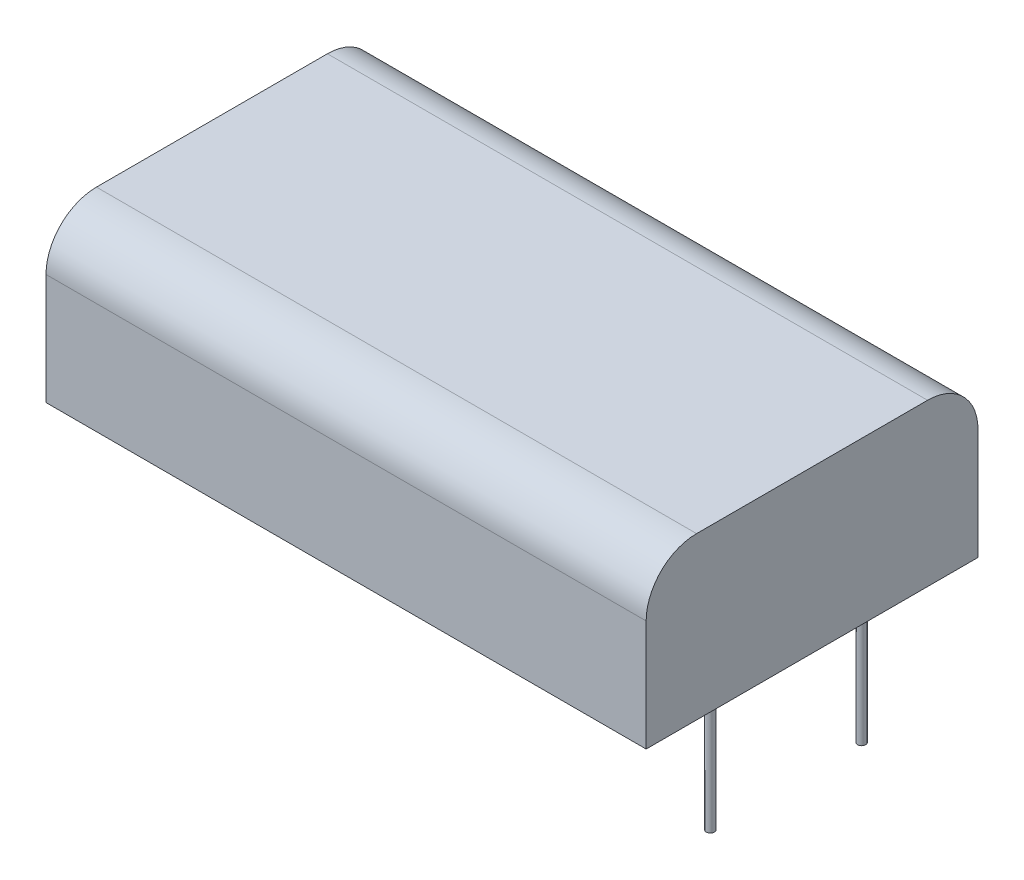
ISO-10303-21;
HEADER;
FILE_DESCRIPTION(('STEP AP214'),'2;1');
FILE_NAME('part.step','',(''),(''),'','','');
FILE_SCHEMA(('AUTOMOTIVE_DESIGN { 1 0 10303 214 1 1 1 1 }'));
ENDSEC;
DATA;
#1=APPLICATION_CONTEXT('core data for automotive mechanical design processes');
#2=APPLICATION_PROTOCOL_DEFINITION('international standard','automotive_design',2000,#1);
#3=PRODUCT_CONTEXT('',#1,'mechanical');
#4=PRODUCT('Part','Part','',(#3));
#5=PRODUCT_RELATED_PRODUCT_CATEGORY('part','',(#4));
#6=PRODUCT_DEFINITION_FORMATION('','',#4);
#7=PRODUCT_DEFINITION_CONTEXT('part definition',#1,'design');
#8=PRODUCT_DEFINITION('design','',#6,#7);
#9=PRODUCT_DEFINITION_SHAPE('','',#8);
#10=(LENGTH_UNIT() NAMED_UNIT(*) SI_UNIT(.MILLI.,.METRE.));
#11=(NAMED_UNIT(*) PLANE_ANGLE_UNIT() SI_UNIT($,.RADIAN.));
#12=(NAMED_UNIT(*) SI_UNIT($,.STERADIAN.) SOLID_ANGLE_UNIT());
#13=UNCERTAINTY_MEASURE_WITH_UNIT(LENGTH_MEASURE(1.E-05),#10,'distance_accuracy_value','');
#14=(GEOMETRIC_REPRESENTATION_CONTEXT(3) GLOBAL_UNCERTAINTY_ASSIGNED_CONTEXT((#13)) GLOBAL_UNIT_ASSIGNED_CONTEXT((#10,
#11,#12)) REPRESENTATION_CONTEXT('',''));
#15=CARTESIAN_POINT('',(0.,0.,0.));
#16=DIRECTION('',(0.,0.,1.));
#17=DIRECTION('',(1.,0.,0.));
#18=AXIS2_PLACEMENT_3D('',#15,#16,#17);
#19=CARTESIAN_POINT('',(29.75,16.,16.45));
#20=DIRECTION('',(-1.,0.,0.));
#21=DIRECTION('',(0.,0.,1.));
#22=AXIS2_PLACEMENT_3D('',#19,#20,#21);
#23=PLANE('',#22);
#24=DIRECTION('',(0.,-1.,0.));
#25=VECTOR('',#24,1.);
#26=CARTESIAN_POINT('',(29.75,16.,-16.45));
#27=LINE('',#26,#25);
#28=CARTESIAN_POINT('',(29.75,11.,-16.45));
#29=VERTEX_POINT('',#28);
#30=CARTESIAN_POINT('',(29.75,0.,-16.45));
#31=VERTEX_POINT('',#30);
#32=EDGE_CURVE('E84',#29,#31,#27,.T.);
#33=ORIENTED_EDGE('',*,*,#32,.F.);
#34=CARTESIAN_POINT('',(29.75,11.,-11.45));
#35=DIRECTION('',(-1.,0.,0.));
#36=DIRECTION('',(0.,0.,1.));
#37=AXIS2_PLACEMENT_3D('',#34,#35,#36);
#38=CIRCLE('',#37,5.);
#39=CARTESIAN_POINT('',(29.75,16.,-11.45));
#40=VERTEX_POINT('',#39);
#41=EDGE_CURVE('E41',#29,#40,#38,.F.);
#42=ORIENTED_EDGE('',*,*,#41,.T.);
#43=DIRECTION('',(0.,0.,-1.));
#44=VECTOR('',#43,1.);
#45=CARTESIAN_POINT('',(29.75,16.,16.45));
#46=LINE('',#45,#44);
#47=CARTESIAN_POINT('',(29.75,16.,11.45));
#48=VERTEX_POINT('',#47);
#49=EDGE_CURVE('E116',#48,#40,#46,.T.);
#50=ORIENTED_EDGE('',*,*,#49,.F.);
#51=CARTESIAN_POINT('',(29.75,11.,11.45));
#52=DIRECTION('',(-1.,0.,0.));
#53=DIRECTION('',(0.,0.,1.));
#54=AXIS2_PLACEMENT_3D('',#51,#52,#53);
#55=CIRCLE('',#54,5.);
#56=CARTESIAN_POINT('',(29.75,11.,16.45));
#57=VERTEX_POINT('',#56);
#58=EDGE_CURVE('E48',#48,#57,#55,.F.);
#59=ORIENTED_EDGE('',*,*,#58,.T.);
#60=DIRECTION('',(0.,-1.,0.));
#61=VECTOR('',#60,1.);
#62=CARTESIAN_POINT('',(29.75,16.,16.45));
#63=LINE('',#62,#61);
#64=CARTESIAN_POINT('',(29.75,0.,16.45));
#65=VERTEX_POINT('',#64);
#66=EDGE_CURVE('E102',#57,#65,#63,.T.);
#67=ORIENTED_EDGE('',*,*,#66,.T.);
#68=DIRECTION('',(0.,0.,-1.));
#69=VECTOR('',#68,1.);
#70=CARTESIAN_POINT('',(29.75,0.,16.45));
#71=LINE('',#70,#69);
#72=EDGE_CURVE('E98',#65,#31,#71,.T.);
#73=ORIENTED_EDGE('',*,*,#72,.T.);
#74=EDGE_LOOP('',(#33,#42,#50,#59,#67,#73));
#75=FACE_BOUND('',#74,.T.);
#76=ADVANCED_FACE('F33',(#75),#23,.F.);
#77=CARTESIAN_POINT('',(-29.75,16.,-16.45));
#78=DIRECTION('',(0.,0.,1.));
#79=DIRECTION('',(1.,0.,0.));
#80=AXIS2_PLACEMENT_3D('',#77,#78,#79);
#81=PLANE('',#80);
#82=DIRECTION('',(0.,-1.,0.));
#83=VECTOR('',#82,1.);
#84=CARTESIAN_POINT('',(-29.75,16.,-16.45));
#85=LINE('',#84,#83);
#86=CARTESIAN_POINT('',(-29.75,11.,-16.45));
#87=VERTEX_POINT('',#86);
#88=CARTESIAN_POINT('',(-29.75,0.,-16.45));
#89=VERTEX_POINT('',#88);
#90=EDGE_CURVE('E92',#87,#89,#85,.T.);
#91=ORIENTED_EDGE('',*,*,#90,.F.);
#92=DIRECTION('',(-1.,0.,0.));
#93=VECTOR('',#92,1.);
#94=CARTESIAN_POINT('',(-29.75,11.,-16.45));
#95=LINE('',#94,#93);
#96=EDGE_CURVE('E56',#87,#29,#95,.F.);
#97=ORIENTED_EDGE('',*,*,#96,.T.);
#98=ORIENTED_EDGE('',*,*,#32,.T.);
#99=DIRECTION('',(-1.,0.,0.));
#100=VECTOR('',#99,1.);
#101=CARTESIAN_POINT('',(-29.75,0.,-16.45));
#102=LINE('',#101,#100);
#103=EDGE_CURVE('E87',#31,#89,#102,.T.);
#104=ORIENTED_EDGE('',*,*,#103,.T.);
#105=EDGE_LOOP('',(#91,#97,#98,#104));
#106=FACE_BOUND('',#105,.T.);
#107=ADVANCED_FACE('F86',(#106),#81,.F.);
#108=CARTESIAN_POINT('',(-29.75,16.,16.45));
#109=DIRECTION('',(1.,0.,0.));
#110=DIRECTION('',(0.,0.,-1.));
#111=AXIS2_PLACEMENT_3D('',#108,#109,#110);
#112=PLANE('',#111);
#113=DIRECTION('',(0.,0.,1.));
#114=VECTOR('',#113,1.);
#115=CARTESIAN_POINT('',(-29.75,16.,16.45));
#116=LINE('',#115,#114);
#117=CARTESIAN_POINT('',(-29.75,16.,-11.45));
#118=VERTEX_POINT('',#117);
#119=CARTESIAN_POINT('',(-29.75,16.,11.45));
#120=VERTEX_POINT('',#119);
#121=EDGE_CURVE('E110',#118,#120,#116,.T.);
#122=ORIENTED_EDGE('',*,*,#121,.F.);
#123=CARTESIAN_POINT('',(-29.75,11.,-11.45));
#124=DIRECTION('',(1.,0.,0.));
#125=DIRECTION('',(0.,0.,-1.));
#126=AXIS2_PLACEMENT_3D('',#123,#124,#125);
#127=CIRCLE('',#126,5.);
#128=EDGE_CURVE('E128',#118,#87,#127,.F.);
#129=ORIENTED_EDGE('',*,*,#128,.T.);
#130=ORIENTED_EDGE('',*,*,#90,.T.);
#131=DIRECTION('',(0.,0.,1.));
#132=VECTOR('',#131,1.);
#133=CARTESIAN_POINT('',(-29.75,0.,16.45));
#134=LINE('',#133,#132);
#135=CARTESIAN_POINT('',(-29.75,0.,16.45));
#136=VERTEX_POINT('',#135);
#137=EDGE_CURVE('E100',#89,#136,#134,.T.);
#138=ORIENTED_EDGE('',*,*,#137,.T.);
#139=DIRECTION('',(0.,-1.,0.));
#140=VECTOR('',#139,1.);
#141=CARTESIAN_POINT('',(-29.75,16.,16.45));
#142=LINE('',#141,#140);
#143=CARTESIAN_POINT('',(-29.75,11.,16.45));
#144=VERTEX_POINT('',#143);
#145=EDGE_CURVE('E118',#144,#136,#142,.T.);
#146=ORIENTED_EDGE('',*,*,#145,.F.);
#147=CARTESIAN_POINT('',(-29.75,11.,11.45));
#148=DIRECTION('',(1.,0.,0.));
#149=DIRECTION('',(0.,0.,-1.));
#150=AXIS2_PLACEMENT_3D('',#147,#148,#149);
#151=CIRCLE('',#150,5.);
#152=EDGE_CURVE('E126',#144,#120,#151,.F.);
#153=ORIENTED_EDGE('',*,*,#152,.T.);
#154=EDGE_LOOP('',(#122,#129,#130,#138,#146,#153));
#155=FACE_BOUND('',#154,.T.);
#156=ADVANCED_FACE('F141',(#155),#112,.F.);
#157=CARTESIAN_POINT('',(-29.75,16.,16.45));
#158=DIRECTION('',(0.,0.,-1.));
#159=DIRECTION('',(-1.,0.,0.));
#160=AXIS2_PLACEMENT_3D('',#157,#158,#159);
#161=PLANE('',#160);
#162=ORIENTED_EDGE('',*,*,#66,.F.);
#163=DIRECTION('',(1.,0.,0.));
#164=VECTOR('',#163,1.);
#165=CARTESIAN_POINT('',(-29.75,11.,16.45));
#166=LINE('',#165,#164);
#167=EDGE_CURVE('E11',#57,#144,#166,.F.);
#168=ORIENTED_EDGE('',*,*,#167,.T.);
#169=ORIENTED_EDGE('',*,*,#145,.T.);
#170=DIRECTION('',(1.,0.,0.));
#171=VECTOR('',#170,1.);
#172=CARTESIAN_POINT('',(-29.75,0.,16.45));
#173=LINE('',#172,#171);
#174=EDGE_CURVE('E114',#136,#65,#173,.T.);
#175=ORIENTED_EDGE('',*,*,#174,.T.);
#176=EDGE_LOOP('',(#162,#168,#169,#175));
#177=FACE_BOUND('',#176,.T.);
#178=ADVANCED_FACE('F147',(#177),#161,.F.);
#179=CARTESIAN_POINT('',(0.,16.,0.));
#180=DIRECTION('',(0.,-1.,0.));
#181=DIRECTION('',(0.,0.,-1.));
#182=AXIS2_PLACEMENT_3D('',#179,#180,#181);
#183=PLANE('',#182);
#184=ORIENTED_EDGE('',*,*,#49,.T.);
#185=DIRECTION('',(-1.,0.,0.));
#186=VECTOR('',#185,1.);
#187=CARTESIAN_POINT('',(0.,16.,-11.45));
#188=LINE('',#187,#186);
#189=EDGE_CURVE('E123',#40,#118,#188,.T.);
#190=ORIENTED_EDGE('',*,*,#189,.T.);
#191=ORIENTED_EDGE('',*,*,#121,.T.);
#192=DIRECTION('',(1.,0.,0.));
#193=VECTOR('',#192,1.);
#194=CARTESIAN_POINT('',(0.,16.,11.45));
#195=LINE('',#194,#193);
#196=EDGE_CURVE('E91',#120,#48,#195,.T.);
#197=ORIENTED_EDGE('',*,*,#196,.T.);
#198=EDGE_LOOP('',(#184,#190,#191,#197));
#199=FACE_BOUND('',#198,.T.);
#200=ADVANCED_FACE('F135',(#199),#183,.F.);
#201=CARTESIAN_POINT('',(0.,0.,0.));
#202=DIRECTION('',(0.,-1.,0.));
#203=DIRECTION('',(0.,0.,-1.));
#204=AXIS2_PLACEMENT_3D('',#201,#202,#203);
#205=PLANE('',#204);
#206=CARTESIAN_POINT('',(27.165,0.,-7.5));
#207=DIRECTION('',(0.,-1.,0.));
#208=DIRECTION('',(0.,0.,-1.));
#209=AXIS2_PLACEMENT_3D('',#206,#207,#208);
#210=CIRCLE('',#209,0.400000000000001);
#211=CARTESIAN_POINT('',(27.165,0.,-7.9));
#212=VERTEX_POINT('',#211);
#213=EDGE_CURVE('E194',#212,#212,#210,.T.);
#214=ORIENTED_EDGE('',*,*,#213,.F.);
#215=EDGE_LOOP('',(#214));
#216=FACE_BOUND('',#215,.T.);
#217=CARTESIAN_POINT('',(27.165,0.,7.5));
#218=DIRECTION('',(0.,-1.,0.));
#219=DIRECTION('',(0.,0.,-1.));
#220=AXIS2_PLACEMENT_3D('',#217,#218,#219);
#221=CIRCLE('',#220,0.400000000000001);
#222=CARTESIAN_POINT('',(27.165,0.,7.1));
#223=VERTEX_POINT('',#222);
#224=EDGE_CURVE('E107',#223,#223,#221,.T.);
#225=ORIENTED_EDGE('',*,*,#224,.F.);
#226=EDGE_LOOP('',(#225));
#227=FACE_BOUND('',#226,.T.);
#228=ORIENTED_EDGE('',*,*,#72,.F.);
#229=ORIENTED_EDGE('',*,*,#174,.F.);
#230=ORIENTED_EDGE('',*,*,#137,.F.);
#231=ORIENTED_EDGE('',*,*,#103,.F.);
#232=EDGE_LOOP('',(#228,#229,#230,#231));
#233=FACE_BOUND('',#232,.T.);
#234=ADVANCED_FACE('F96',(#216,#227,#233),#205,.T.);
#235=CARTESIAN_POINT('',(0.,11.,-11.45));
#236=DIRECTION('',(-1.,0.,0.));
#237=DIRECTION('',(0.,0.,1.));
#238=AXIS2_PLACEMENT_3D('',#235,#236,#237);
#239=CYLINDRICAL_SURFACE('',#238,5.);
#240=ORIENTED_EDGE('',*,*,#41,.F.);
#241=ORIENTED_EDGE('',*,*,#96,.F.);
#242=ORIENTED_EDGE('',*,*,#128,.F.);
#243=ORIENTED_EDGE('',*,*,#189,.F.);
#244=EDGE_LOOP('',(#240,#241,#242,#243));
#245=FACE_BOUND('',#244,.T.);
#246=ADVANCED_FACE('F139',(#245),#239,.T.);
#247=CARTESIAN_POINT('',(0.,11.,11.45));
#248=DIRECTION('',(1.,0.,0.));
#249=DIRECTION('',(0.,0.,-1.));
#250=AXIS2_PLACEMENT_3D('',#247,#248,#249);
#251=CYLINDRICAL_SURFACE('',#250,5.);
#252=ORIENTED_EDGE('',*,*,#152,.F.);
#253=ORIENTED_EDGE('',*,*,#167,.F.);
#254=ORIENTED_EDGE('',*,*,#58,.F.);
#255=ORIENTED_EDGE('',*,*,#196,.F.);
#256=EDGE_LOOP('',(#252,#253,#254,#255));
#257=FACE_BOUND('',#256,.T.);
#258=ADVANCED_FACE('F35',(#257),#251,.T.);
#259=CARTESIAN_POINT('',(27.165,-12.7,7.5));
#260=DIRECTION('',(0.,1.,0.));
#261=DIRECTION('',(0.,0.,1.));
#262=AXIS2_PLACEMENT_3D('',#259,#260,#261);
#263=CYLINDRICAL_SURFACE('',#262,0.400000000000001);
#264=CARTESIAN_POINT('',(27.165,-12.7,7.5));
#265=DIRECTION('',(0.,-1.,0.));
#266=DIRECTION('',(0.,0.,-1.));
#267=AXIS2_PLACEMENT_3D('',#264,#265,#266);
#268=CIRCLE('',#267,0.400000000000001);
#269=CARTESIAN_POINT('',(27.165,-12.7,7.1));
#270=VERTEX_POINT('',#269);
#271=EDGE_CURVE('E104',#270,#270,#268,.T.);
#272=ORIENTED_EDGE('',*,*,#271,.F.);
#273=EDGE_LOOP('',(#272));
#274=FACE_BOUND('',#273,.T.);
#275=ORIENTED_EDGE('',*,*,#224,.T.);
#276=EDGE_LOOP('',(#275));
#277=FACE_BOUND('',#276,.T.);
#278=ADVANCED_FACE('F168',(#274,#277),#263,.T.);
#279=CARTESIAN_POINT('',(27.165,-12.7,7.5));
#280=DIRECTION('',(0.,-1.,0.));
#281=DIRECTION('',(0.,0.,-1.));
#282=AXIS2_PLACEMENT_3D('',#279,#280,#281);
#283=PLANE('',#282);
#284=ORIENTED_EDGE('',*,*,#271,.T.);
#285=EDGE_LOOP('',(#284));
#286=FACE_BOUND('',#285,.T.);
#287=ADVANCED_FACE('F177',(#286),#283,.T.);
#288=CARTESIAN_POINT('',(27.165,-12.7,-7.5));
#289=DIRECTION('',(0.,1.,0.));
#290=DIRECTION('',(0.,0.,1.));
#291=AXIS2_PLACEMENT_3D('',#288,#289,#290);
#292=CYLINDRICAL_SURFACE('',#291,0.400000000000001);
#293=CARTESIAN_POINT('',(27.165,-12.7,-7.5));
#294=DIRECTION('',(0.,-1.,0.));
#295=DIRECTION('',(0.,0.,-1.));
#296=AXIS2_PLACEMENT_3D('',#293,#294,#295);
#297=CIRCLE('',#296,0.400000000000001);
#298=CARTESIAN_POINT('',(27.165,-12.7,-7.9));
#299=VERTEX_POINT('',#298);
#300=EDGE_CURVE('E193',#299,#299,#297,.T.);
#301=ORIENTED_EDGE('',*,*,#300,.F.);
#302=EDGE_LOOP('',(#301));
#303=FACE_BOUND('',#302,.T.);
#304=ORIENTED_EDGE('',*,*,#213,.T.);
#305=EDGE_LOOP('',(#304));
#306=FACE_BOUND('',#305,.T.);
#307=ADVANCED_FACE('F181',(#303,#306),#292,.T.);
#308=CARTESIAN_POINT('',(27.165,-12.7,-7.5));
#309=DIRECTION('',(0.,-1.,0.));
#310=DIRECTION('',(0.,0.,-1.));
#311=AXIS2_PLACEMENT_3D('',#308,#309,#310);
#312=PLANE('',#311);
#313=ORIENTED_EDGE('',*,*,#300,.T.);
#314=EDGE_LOOP('',(#313));
#315=FACE_BOUND('',#314,.T.);
#316=ADVANCED_FACE('F185',(#315),#312,.T.);
#317=CLOSED_SHELL('',(#76,#107,#156,#178,#200,#234,#246,#258,#278,#287,#307,#316));
#318=MANIFOLD_SOLID_BREP('B2',#317);
#319=ADVANCED_BREP_SHAPE_REPRESENTATION('',(#18,#318),#14);
#320=SHAPE_DEFINITION_REPRESENTATION(#9,#319);
ENDSEC;
END-ISO-10303-21;
